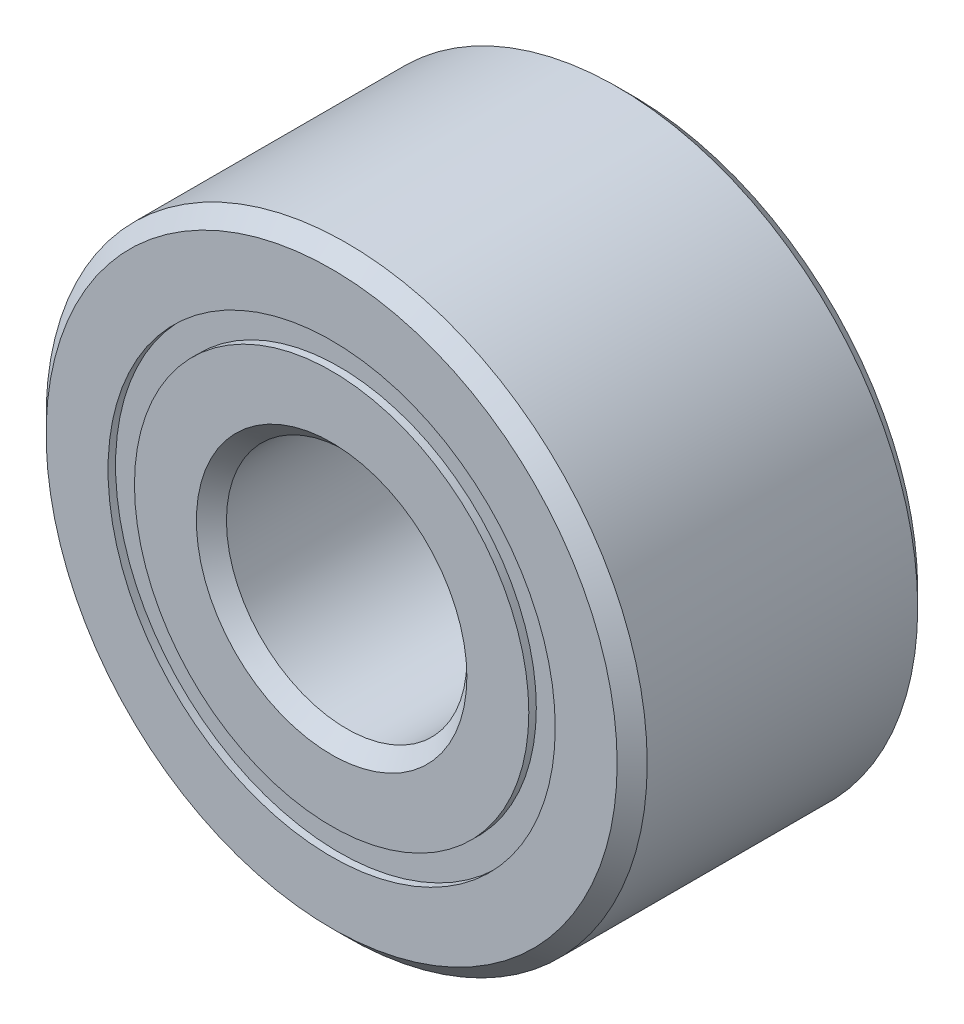
ISO-10303-21;
HEADER;
FILE_DESCRIPTION(('STEP AP214'),'2;1');
FILE_NAME('part.step','',(''),(''),'','','');
FILE_SCHEMA(('AUTOMOTIVE_DESIGN { 1 0 10303 214 1 1 1 1 }'));
ENDSEC;
DATA;
#1=APPLICATION_CONTEXT('core data for automotive mechanical design processes');
#2=APPLICATION_PROTOCOL_DEFINITION('international standard','automotive_design',2000,#1);
#3=PRODUCT_CONTEXT('',#1,'mechanical');
#4=PRODUCT('Part','Part','',(#3));
#5=PRODUCT_RELATED_PRODUCT_CATEGORY('part','',(#4));
#6=PRODUCT_DEFINITION_FORMATION('','',#4);
#7=PRODUCT_DEFINITION_CONTEXT('part definition',#1,'design');
#8=PRODUCT_DEFINITION('design','',#6,#7);
#9=PRODUCT_DEFINITION_SHAPE('','',#8);
#10=(LENGTH_UNIT() NAMED_UNIT(*) SI_UNIT(.MILLI.,.METRE.));
#11=(NAMED_UNIT(*) PLANE_ANGLE_UNIT() SI_UNIT($,.RADIAN.));
#12=(NAMED_UNIT(*) SI_UNIT($,.STERADIAN.) SOLID_ANGLE_UNIT());
#13=UNCERTAINTY_MEASURE_WITH_UNIT(LENGTH_MEASURE(1.E-05),#10,'distance_accuracy_value','');
#14=(GEOMETRIC_REPRESENTATION_CONTEXT(3) GLOBAL_UNCERTAINTY_ASSIGNED_CONTEXT((#13)) GLOBAL_UNIT_ASSIGNED_CONTEXT((#10,
#11,#12)) REPRESENTATION_CONTEXT('',''));
#15=CARTESIAN_POINT('',(0.,0.,0.));
#16=DIRECTION('',(0.,0.,1.));
#17=DIRECTION('',(1.,0.,0.));
#18=AXIS2_PLACEMENT_3D('',#15,#16,#17);
#19=CARTESIAN_POINT('',(0.,1.85989010989011,-1.1875));
#20=DIRECTION('',(0.,0.,1.));
#21=DIRECTION('',(1.,0.,0.));
#22=AXIS2_PLACEMENT_3D('',#19,#20,#21);
#23=PLANE('',#22);
#24=CARTESIAN_POINT('',(0.,0.,-1.1875));
#25=DIRECTION('',(0.,0.,1.));
#26=DIRECTION('',(1.,0.,0.));
#27=AXIS2_PLACEMENT_3D('',#24,#25,#26);
#28=CIRCLE('',#27,1.85989010989011);
#29=CARTESIAN_POINT('',(1.85989010989011,0.,-1.1875));
#30=VERTEX_POINT('',#29);
#31=EDGE_CURVE('E55',#30,#30,#28,.T.);
#32=ORIENTED_EDGE('',*,*,#31,.F.);
#33=EDGE_LOOP('',(#32));
#34=FACE_BOUND('',#33,.T.);
#35=CARTESIAN_POINT('',(0.,0.,-1.1875));
#36=DIRECTION('',(0.,0.,1.));
#37=DIRECTION('',(1.,0.,0.));
#38=AXIS2_PLACEMENT_3D('',#35,#36,#37);
#39=CIRCLE('',#38,1.64010989010989);
#40=CARTESIAN_POINT('',(1.64010989010989,0.,-1.1875));
#41=VERTEX_POINT('',#40);
#42=EDGE_CURVE('E11',#41,#41,#39,.T.);
#43=ORIENTED_EDGE('',*,*,#42,.T.);
#44=EDGE_LOOP('',(#43));
#45=FACE_BOUND('',#44,.T.);
#46=ADVANCED_FACE('F41',(#34,#45),#23,.F.);
#47=CARTESIAN_POINT('',(0.,0.,1.25));
#48=DIRECTION('',(0.,0.,1.));
#49=DIRECTION('',(1.,0.,0.));
#50=AXIS2_PLACEMENT_3D('',#47,#48,#49);
#51=CYLINDRICAL_SURFACE('',#50,1.64010989010989);
#52=ORIENTED_EDGE('',*,*,#42,.F.);
#53=EDGE_LOOP('',(#52));
#54=FACE_BOUND('',#53,.T.);
#55=CARTESIAN_POINT('',(0.,0.,-0.566319531325119));
#56=DIRECTION('',(0.,0.,1.));
#57=DIRECTION('',(1.,0.,0.));
#58=AXIS2_PLACEMENT_3D('',#55,#56,#57);
#59=CIRCLE('',#58,1.64010989010989);
#60=CARTESIAN_POINT('',(1.64010989010989,0.,-0.566319531325119));
#61=VERTEX_POINT('',#60);
#62=EDGE_CURVE('E47',#61,#61,#59,.T.);
#63=ORIENTED_EDGE('',*,*,#62,.T.);
#64=EDGE_LOOP('',(#63));
#65=FACE_BOUND('',#64,.T.);
#66=ADVANCED_FACE('F64',(#54,#65),#51,.F.);
#67=CARTESIAN_POINT('',(0.,1.85989010989011,-0.566319531325119));
#68=DIRECTION('',(0.,0.,-1.));
#69=DIRECTION('',(-1.,0.,0.));
#70=AXIS2_PLACEMENT_3D('',#67,#68,#69);
#71=PLANE('',#70);
#72=ORIENTED_EDGE('',*,*,#62,.F.);
#73=EDGE_LOOP('',(#72));
#74=FACE_BOUND('',#73,.T.);
#75=CARTESIAN_POINT('',(0.,0.,-0.566319531325119));
#76=DIRECTION('',(0.,0.,1.));
#77=DIRECTION('',(1.,0.,0.));
#78=AXIS2_PLACEMENT_3D('',#75,#76,#77);
#79=CIRCLE('',#78,1.85989010989011);
#80=CARTESIAN_POINT('',(1.85989010989011,0.,-0.566319531325119));
#81=VERTEX_POINT('',#80);
#82=EDGE_CURVE('E51',#81,#81,#79,.T.);
#83=ORIENTED_EDGE('',*,*,#82,.T.);
#84=EDGE_LOOP('',(#83));
#85=FACE_BOUND('',#84,.T.);
#86=ADVANCED_FACE('F68',(#74,#85),#71,.F.);
#87=CARTESIAN_POINT('',(0.,0.,1.25));
#88=DIRECTION('',(0.,0.,1.));
#89=DIRECTION('',(1.,0.,0.));
#90=AXIS2_PLACEMENT_3D('',#87,#88,#89);
#91=CYLINDRICAL_SURFACE('',#90,1.85989010989011);
#92=ORIENTED_EDGE('',*,*,#82,.F.);
#93=EDGE_LOOP('',(#92));
#94=FACE_BOUND('',#93,.T.);
#95=ORIENTED_EDGE('',*,*,#31,.T.);
#96=EDGE_LOOP('',(#95));
#97=FACE_BOUND('',#96,.T.);
#98=ADVANCED_FACE('F61',(#94,#97),#91,.T.);
#99=CLOSED_SHELL('',(#46,#66,#86,#98));
#100=MANIFOLD_SOLID_BREP('B2',#99);
#101=CARTESIAN_POINT('',(0.,1.85989010989011,1.1875));
#102=DIRECTION('',(0.,0.,-1.));
#103=DIRECTION('',(-1.,0.,0.));
#104=AXIS2_PLACEMENT_3D('',#101,#102,#103);
#105=PLANE('',#104);
#106=CARTESIAN_POINT('',(0.,0.,1.1875));
#107=DIRECTION('',(0.,0.,1.));
#108=DIRECTION('',(1.,0.,0.));
#109=AXIS2_PLACEMENT_3D('',#106,#107,#108);
#110=CIRCLE('',#109,1.64010989010989);
#111=CARTESIAN_POINT('',(1.64010989010989,0.,1.1875));
#112=VERTEX_POINT('',#111);
#113=EDGE_CURVE('E40',#112,#112,#110,.T.);
#114=ORIENTED_EDGE('',*,*,#113,.F.);
#115=EDGE_LOOP('',(#114));
#116=FACE_BOUND('',#115,.T.);
#117=CARTESIAN_POINT('',(0.,0.,1.1875));
#118=DIRECTION('',(0.,0.,1.));
#119=DIRECTION('',(1.,0.,0.));
#120=AXIS2_PLACEMENT_3D('',#117,#118,#119);
#121=CIRCLE('',#120,1.85989010989011);
#122=CARTESIAN_POINT('',(1.85989010989011,0.,1.1875));
#123=VERTEX_POINT('',#122);
#124=EDGE_CURVE('E122',#123,#123,#121,.T.);
#125=ORIENTED_EDGE('',*,*,#124,.T.);
#126=EDGE_LOOP('',(#125));
#127=FACE_BOUND('',#126,.T.);
#128=ADVANCED_FACE('F108',(#116,#127),#105,.F.);
#129=CARTESIAN_POINT('',(0.,0.,1.25));
#130=DIRECTION('',(0.,0.,1.));
#131=DIRECTION('',(1.,0.,0.));
#132=AXIS2_PLACEMENT_3D('',#129,#130,#131);
#133=CYLINDRICAL_SURFACE('',#132,1.64010989010989);
#134=CARTESIAN_POINT('',(0.,0.,0.566319531325118));
#135=DIRECTION('',(0.,0.,1.));
#136=DIRECTION('',(1.,0.,0.));
#137=AXIS2_PLACEMENT_3D('',#134,#135,#136);
#138=CIRCLE('',#137,1.64010989010989);
#139=CARTESIAN_POINT('',(1.64010989010989,0.,0.566319531325118));
#140=VERTEX_POINT('',#139);
#141=EDGE_CURVE('E114',#140,#140,#138,.T.);
#142=ORIENTED_EDGE('',*,*,#141,.F.);
#143=EDGE_LOOP('',(#142));
#144=FACE_BOUND('',#143,.T.);
#145=ORIENTED_EDGE('',*,*,#113,.T.);
#146=EDGE_LOOP('',(#145));
#147=FACE_BOUND('',#146,.T.);
#148=ADVANCED_FACE('F137',(#144,#147),#133,.F.);
#149=CARTESIAN_POINT('',(0.,1.85989010989011,0.566319531325118));
#150=DIRECTION('',(0.,0.,1.));
#151=DIRECTION('',(1.,0.,0.));
#152=AXIS2_PLACEMENT_3D('',#149,#150,#151);
#153=PLANE('',#152);
#154=CARTESIAN_POINT('',(0.,0.,0.566319531325118));
#155=DIRECTION('',(0.,0.,1.));
#156=DIRECTION('',(1.,0.,0.));
#157=AXIS2_PLACEMENT_3D('',#154,#155,#156);
#158=CIRCLE('',#157,1.85989010989011);
#159=CARTESIAN_POINT('',(1.85989010989011,0.,0.566319531325118));
#160=VERTEX_POINT('',#159);
#161=EDGE_CURVE('E118',#160,#160,#158,.T.);
#162=ORIENTED_EDGE('',*,*,#161,.F.);
#163=EDGE_LOOP('',(#162));
#164=FACE_BOUND('',#163,.T.);
#165=ORIENTED_EDGE('',*,*,#141,.T.);
#166=EDGE_LOOP('',(#165));
#167=FACE_BOUND('',#166,.T.);
#168=ADVANCED_FACE('F132',(#164,#167),#153,.F.);
#169=CARTESIAN_POINT('',(0.,0.,1.25));
#170=DIRECTION('',(0.,0.,1.));
#171=DIRECTION('',(1.,0.,0.));
#172=AXIS2_PLACEMENT_3D('',#169,#170,#171);
#173=CYLINDRICAL_SURFACE('',#172,1.85989010989011);
#174=ORIENTED_EDGE('',*,*,#124,.F.);
#175=EDGE_LOOP('',(#174));
#176=FACE_BOUND('',#175,.T.);
#177=ORIENTED_EDGE('',*,*,#161,.T.);
#178=EDGE_LOOP('',(#177));
#179=FACE_BOUND('',#178,.T.);
#180=ADVANCED_FACE('F129',(#176,#179),#173,.T.);
#181=CLOSED_SHELL('',(#128,#148,#168,#180));
#182=MANIFOLD_SOLID_BREP('B6',#181);
#183=CARTESIAN_POINT('',(-1.23743686707644,1.23743686707647,0.));
#184=DIRECTION('',(0.,0.,1.));
#185=DIRECTION('',(-0.707106781186539,0.707106781186556,0.));
#186=AXIS2_PLACEMENT_3D('',#183,#184,#185);
#187=SPHERICAL_SURFACE('',#186,0.566319531325119);
#188=CARTESIAN_POINT('',(-1.23743686707644,1.23743686707647,0.566319531325118));
#189=VERTEX_POINT('',#188);
#190=VERTEX_LOOP('',#189);
#191=FACE_BOUND('',#190,.T.);
#192=ADVANCED_FACE('F175',(#191),#187,.T.);
#193=CLOSED_SHELL('',(#192));
#194=MANIFOLD_SOLID_BREP('B35',#193);
#195=CARTESIAN_POINT('',(-1.75,0.,0.));
#196=DIRECTION('',(0.,0.,1.));
#197=DIRECTION('',(-1.,0.,0.));
#198=AXIS2_PLACEMENT_3D('',#195,#196,#197);
#199=SPHERICAL_SURFACE('',#198,0.566319531325119);
#200=CARTESIAN_POINT('',(-1.75,0.,0.566319531325118));
#201=VERTEX_POINT('',#200);
#202=VERTEX_LOOP('',#201);
#203=FACE_BOUND('',#202,.T.);
#204=ADVANCED_FACE('F195',(#203),#199,.T.);
#205=CLOSED_SHELL('',(#204));
#206=MANIFOLD_SOLID_BREP('B104',#205);
#207=CARTESIAN_POINT('',(-1.23743686707647,-1.23743686707645,0.));
#208=DIRECTION('',(0.,0.,1.));
#209=DIRECTION('',(-0.707106781186554,-0.707106781186541,0.));
#210=AXIS2_PLACEMENT_3D('',#207,#208,#209);
#211=SPHERICAL_SURFACE('',#210,0.566319531325119);
#212=CARTESIAN_POINT('',(-1.23743686707647,-1.23743686707645,0.566319531325118));
#213=VERTEX_POINT('',#212);
#214=VERTEX_LOOP('',#213);
#215=FACE_BOUND('',#214,.T.);
#216=ADVANCED_FACE('F215',(#215),#211,.T.);
#217=CLOSED_SHELL('',(#216));
#218=MANIFOLD_SOLID_BREP('B171',#217);
#219=CARTESIAN_POINT('',(0.,-1.75,0.));
#220=DIRECTION('',(0.,0.,1.));
#221=DIRECTION('',(0.,-1.,0.));
#222=AXIS2_PLACEMENT_3D('',#219,#220,#221);
#223=SPHERICAL_SURFACE('',#222,0.566319531325119);
#224=CARTESIAN_POINT('',(0.,-1.75,0.566319531325118));
#225=VERTEX_POINT('',#224);
#226=VERTEX_LOOP('',#225);
#227=FACE_BOUND('',#226,.T.);
#228=ADVANCED_FACE('F235',(#227),#223,.T.);
#229=CLOSED_SHELL('',(#228));
#230=MANIFOLD_SOLID_BREP('B191',#229);
#231=CARTESIAN_POINT('',(1.23743686707645,-1.23743686707646,0.));
#232=DIRECTION('',(0.,0.,1.));
#233=DIRECTION('',(0.707106781186544,-0.707106781186551,0.));
#234=AXIS2_PLACEMENT_3D('',#231,#232,#233);
#235=SPHERICAL_SURFACE('',#234,0.566319531325119);
#236=CARTESIAN_POINT('',(1.23743686707645,-1.23743686707646,0.566319531325118));
#237=VERTEX_POINT('',#236);
#238=VERTEX_LOOP('',#237);
#239=FACE_BOUND('',#238,.T.);
#240=ADVANCED_FACE('F255',(#239),#235,.T.);
#241=CLOSED_SHELL('',(#240));
#242=MANIFOLD_SOLID_BREP('B211',#241);
#243=CARTESIAN_POINT('',(1.75,0.,0.));
#244=DIRECTION('',(0.,0.,1.));
#245=DIRECTION('',(1.,0.,0.));
#246=AXIS2_PLACEMENT_3D('',#243,#244,#245);
#247=SPHERICAL_SURFACE('',#246,0.566319531325119);
#248=CARTESIAN_POINT('',(1.75,0.,0.566319531325118));
#249=VERTEX_POINT('',#248);
#250=VERTEX_LOOP('',#249);
#251=FACE_BOUND('',#250,.T.);
#252=ADVANCED_FACE('F275',(#251),#247,.T.);
#253=CLOSED_SHELL('',(#252));
#254=MANIFOLD_SOLID_BREP('B231',#253);
#255=CARTESIAN_POINT('',(1.23743686707646,1.23743686707646,0.));
#256=DIRECTION('',(0.,0.,1.));
#257=DIRECTION('',(0.707106781186549,0.707106781186546,0.));
#258=AXIS2_PLACEMENT_3D('',#255,#256,#257);
#259=SPHERICAL_SURFACE('',#258,0.566319531325119);
#260=CARTESIAN_POINT('',(1.23743686707646,1.23743686707646,0.566319531325118));
#261=VERTEX_POINT('',#260);
#262=VERTEX_LOOP('',#261);
#263=FACE_BOUND('',#262,.T.);
#264=ADVANCED_FACE('F295',(#263),#259,.T.);
#265=CLOSED_SHELL('',(#264));
#266=MANIFOLD_SOLID_BREP('B251',#265);
#267=CARTESIAN_POINT('',(0.,1.75,0.));
#268=DIRECTION('',(0.,0.,1.));
#269=DIRECTION('',(0.,1.,0.));
#270=AXIS2_PLACEMENT_3D('',#267,#268,#269);
#271=SPHERICAL_SURFACE('',#270,0.566319531325119);
#272=CARTESIAN_POINT('',(0.,1.75,0.566319531325118));
#273=VERTEX_POINT('',#272);
#274=VERTEX_LOOP('',#273);
#275=FACE_BOUND('',#274,.T.);
#276=ADVANCED_FACE('F317',(#275),#271,.T.);
#277=CLOSED_SHELL('',(#276));
#278=MANIFOLD_SOLID_BREP('B271',#277);
#279=CARTESIAN_POINT('',(0.,1.64010989010989,1.25));
#280=DIRECTION('',(0.,0.,-1.));
#281=DIRECTION('',(-1.,0.,0.));
#282=AXIS2_PLACEMENT_3D('',#279,#280,#281);
#283=PLANE('',#282);
#284=CARTESIAN_POINT('',(0.,0.,1.25));
#285=DIRECTION('',(0.,0.,1.));
#286=DIRECTION('',(1.,0.,0.));
#287=AXIS2_PLACEMENT_3D('',#284,#285,#286);
#288=CIRCLE('',#287,1.125);
#289=CARTESIAN_POINT('',(1.125,0.,1.25));
#290=VERTEX_POINT('',#289);
#291=EDGE_CURVE('E364',#290,#290,#288,.T.);
#292=ORIENTED_EDGE('',*,*,#291,.F.);
#293=EDGE_LOOP('',(#292));
#294=FACE_BOUND('',#293,.T.);
#295=CARTESIAN_POINT('',(0.,0.,1.25));
#296=DIRECTION('',(0.,0.,1.));
#297=DIRECTION('',(1.,0.,0.));
#298=AXIS2_PLACEMENT_3D('',#295,#296,#297);
#299=CIRCLE('',#298,1.64010989010989);
#300=CARTESIAN_POINT('',(1.64010989010989,0.,1.25));
#301=VERTEX_POINT('',#300);
#302=EDGE_CURVE('E316',#301,#301,#299,.T.);
#303=ORIENTED_EDGE('',*,*,#302,.T.);
#304=EDGE_LOOP('',(#303));
#305=FACE_BOUND('',#304,.T.);
#306=ADVANCED_FACE('F336',(#294,#305),#283,.F.);
#307=CARTESIAN_POINT('',(0.,0.,1.25));
#308=DIRECTION('',(0.,0.,1.));
#309=DIRECTION('',(1.,0.,0.));
#310=AXIS2_PLACEMENT_3D('',#307,#308,#309);
#311=CYLINDRICAL_SURFACE('',#310,1.64010989010989);
#312=ORIENTED_EDGE('',*,*,#302,.F.);
#313=EDGE_LOOP('',(#312));
#314=FACE_BOUND('',#313,.T.);
#315=CARTESIAN_POINT('',(0.,0.,0.555555555555555));
#316=DIRECTION('',(0.,0.,1.));
#317=DIRECTION('',(1.,0.,0.));
#318=AXIS2_PLACEMENT_3D('',#315,#316,#317);
#319=CIRCLE('',#318,1.64010989010989);
#320=CARTESIAN_POINT('',(1.64010989010989,0.,0.555555555555555));
#321=VERTEX_POINT('',#320);
#322=EDGE_CURVE('E342',#321,#321,#319,.T.);
#323=ORIENTED_EDGE('',*,*,#322,.T.);
#324=EDGE_LOOP('',(#323));
#325=FACE_BOUND('',#324,.T.);
#326=ADVANCED_FACE('F371',(#314,#325),#311,.T.);
#327=CARTESIAN_POINT('',(0.,0.,0.));
#328=DIRECTION('',(0.,0.,1.));
#329=DIRECTION('',(1.,0.,0.));
#330=AXIS2_PLACEMENT_3D('',#327,#328,#329);
#331=TOROIDAL_SURFACE('',#330,1.75,0.566319531325118);
#332=ORIENTED_EDGE('',*,*,#322,.F.);
#333=EDGE_LOOP('',(#332));
#334=FACE_BOUND('',#333,.T.);
#335=CARTESIAN_POINT('',(0.,0.,-0.555555555555556));
#336=DIRECTION('',(0.,0.,1.));
#337=DIRECTION('',(1.,0.,0.));
#338=AXIS2_PLACEMENT_3D('',#335,#336,#337);
#339=CIRCLE('',#338,1.64010989010989);
#340=CARTESIAN_POINT('',(1.64010989010989,0.,-0.555555555555556));
#341=VERTEX_POINT('',#340);
#342=EDGE_CURVE('E346',#341,#341,#339,.T.);
#343=ORIENTED_EDGE('',*,*,#342,.T.);
#344=EDGE_LOOP('',(#343));
#345=FACE_BOUND('',#344,.T.);
#346=ADVANCED_FACE('F375',(#334,#345),#331,.F.);
#347=CARTESIAN_POINT('',(0.,0.,1.25));
#348=DIRECTION('',(0.,0.,1.));
#349=DIRECTION('',(1.,0.,0.));
#350=AXIS2_PLACEMENT_3D('',#347,#348,#349);
#351=CYLINDRICAL_SURFACE('',#350,1.64010989010989);
#352=ORIENTED_EDGE('',*,*,#342,.F.);
#353=EDGE_LOOP('',(#352));
#354=FACE_BOUND('',#353,.T.);
#355=CARTESIAN_POINT('',(0.,0.,-1.25));
#356=DIRECTION('',(0.,0.,1.));
#357=DIRECTION('',(1.,0.,0.));
#358=AXIS2_PLACEMENT_3D('',#355,#356,#357);
#359=CIRCLE('',#358,1.64010989010989);
#360=CARTESIAN_POINT('',(1.64010989010989,0.,-1.25));
#361=VERTEX_POINT('',#360);
#362=EDGE_CURVE('E350',#361,#361,#359,.T.);
#363=ORIENTED_EDGE('',*,*,#362,.T.);
#364=EDGE_LOOP('',(#363));
#365=FACE_BOUND('',#364,.T.);
#366=ADVANCED_FACE('F380',(#354,#365),#351,.T.);
#367=CARTESIAN_POINT('',(0.,1.125,-1.25));
#368=DIRECTION('',(0.,0.,1.));
#369=DIRECTION('',(1.,0.,0.));
#370=AXIS2_PLACEMENT_3D('',#367,#368,#369);
#371=PLANE('',#370);
#372=ORIENTED_EDGE('',*,*,#362,.F.);
#373=EDGE_LOOP('',(#372));
#374=FACE_BOUND('',#373,.T.);
#375=CARTESIAN_POINT('',(0.,0.,-1.25));
#376=DIRECTION('',(0.,0.,1.));
#377=DIRECTION('',(1.,0.,0.));
#378=AXIS2_PLACEMENT_3D('',#375,#376,#377);
#379=CIRCLE('',#378,1.125);
#380=CARTESIAN_POINT('',(1.125,0.,-1.25));
#381=VERTEX_POINT('',#380);
#382=EDGE_CURVE('E355',#381,#381,#379,.T.);
#383=ORIENTED_EDGE('',*,*,#382,.T.);
#384=EDGE_LOOP('',(#383));
#385=FACE_BOUND('',#384,.T.);
#386=ADVANCED_FACE('F386',(#374,#385),#371,.F.);
#387=CARTESIAN_POINT('',(0.,0.,-1.125));
#388=DIRECTION('',(0.,0.,-1.));
#389=DIRECTION('',(-1.,0.,0.));
#390=AXIS2_PLACEMENT_3D('',#387,#388,#389);
#391=CONICAL_SURFACE('',#390,1.,0.785398163397448);
#392=ORIENTED_EDGE('',*,*,#382,.F.);
#393=EDGE_LOOP('',(#392));
#394=FACE_BOUND('',#393,.T.);
#395=CARTESIAN_POINT('',(0.,0.,-1.125));
#396=DIRECTION('',(0.,0.,1.));
#397=DIRECTION('',(1.,0.,0.));
#398=AXIS2_PLACEMENT_3D('',#395,#396,#397);
#399=CIRCLE('',#398,1.);
#400=CARTESIAN_POINT('',(1.,0.,-1.125));
#401=VERTEX_POINT('',#400);
#402=EDGE_CURVE('E358',#401,#401,#399,.T.);
#403=ORIENTED_EDGE('',*,*,#402,.T.);
#404=EDGE_LOOP('',(#403));
#405=FACE_BOUND('',#404,.T.);
#406=ADVANCED_FACE('F390',(#394,#405),#391,.F.);
#407=CARTESIAN_POINT('',(0.,0.,1.25));
#408=DIRECTION('',(0.,0.,1.));
#409=DIRECTION('',(1.,0.,0.));
#410=AXIS2_PLACEMENT_3D('',#407,#408,#409);
#411=CYLINDRICAL_SURFACE('',#410,1.);
#412=ORIENTED_EDGE('',*,*,#402,.F.);
#413=EDGE_LOOP('',(#412));
#414=FACE_BOUND('',#413,.T.);
#415=CARTESIAN_POINT('',(0.,0.,1.125));
#416=DIRECTION('',(0.,0.,1.));
#417=DIRECTION('',(1.,0.,0.));
#418=AXIS2_PLACEMENT_3D('',#415,#416,#417);
#419=CIRCLE('',#418,1.);
#420=CARTESIAN_POINT('',(1.,0.,1.125));
#421=VERTEX_POINT('',#420);
#422=EDGE_CURVE('E361',#421,#421,#419,.T.);
#423=ORIENTED_EDGE('',*,*,#422,.T.);
#424=EDGE_LOOP('',(#423));
#425=FACE_BOUND('',#424,.T.);
#426=ADVANCED_FACE('F394',(#414,#425),#411,.F.);
#427=CARTESIAN_POINT('',(0.,0.,1.25));
#428=DIRECTION('',(0.,0.,1.));
#429=DIRECTION('',(1.,0.,0.));
#430=AXIS2_PLACEMENT_3D('',#427,#428,#429);
#431=CONICAL_SURFACE('',#430,1.125,0.785398163397447);
#432=ORIENTED_EDGE('',*,*,#422,.F.);
#433=EDGE_LOOP('',(#432));
#434=FACE_BOUND('',#433,.T.);
#435=ORIENTED_EDGE('',*,*,#291,.T.);
#436=EDGE_LOOP('',(#435));
#437=FACE_BOUND('',#436,.T.);
#438=ADVANCED_FACE('F368',(#434,#437),#431,.F.);
#439=CLOSED_SHELL('',(#306,#326,#346,#366,#386,#406,#426,#438));
#440=MANIFOLD_SOLID_BREP('B291',#439);
#441=CARTESIAN_POINT('',(0.,0.,1.125));
#442=DIRECTION('',(0.,0.,-1.));
#443=DIRECTION('',(-1.,0.,0.));
#444=AXIS2_PLACEMENT_3D('',#441,#442,#443);
#445=CONICAL_SURFACE('',#444,2.5,0.785398163397449);
#446=CARTESIAN_POINT('',(0.,0.,1.25));
#447=DIRECTION('',(0.,0.,1.));
#448=DIRECTION('',(1.,0.,0.));
#449=AXIS2_PLACEMENT_3D('',#446,#447,#448);
#450=CIRCLE('',#449,2.375);
#451=CARTESIAN_POINT('',(2.375,0.,1.25));
#452=VERTEX_POINT('',#451);
#453=EDGE_CURVE('E485',#452,#452,#450,.T.);
#454=ORIENTED_EDGE('',*,*,#453,.F.);
#455=EDGE_LOOP('',(#454));
#456=FACE_BOUND('',#455,.T.);
#457=CARTESIAN_POINT('',(0.,0.,1.125));
#458=DIRECTION('',(0.,0.,1.));
#459=DIRECTION('',(1.,0.,0.));
#460=AXIS2_PLACEMENT_3D('',#457,#458,#459);
#461=CIRCLE('',#460,2.5);
#462=CARTESIAN_POINT('',(2.5,0.,1.125));
#463=VERTEX_POINT('',#462);
#464=EDGE_CURVE('E335',#463,#463,#461,.T.);
#465=ORIENTED_EDGE('',*,*,#464,.T.);
#466=EDGE_LOOP('',(#465));
#467=FACE_BOUND('',#466,.T.);
#468=ADVANCED_FACE('F457',(#456,#467),#445,.T.);
#469=CARTESIAN_POINT('',(0.,0.,1.25));
#470=DIRECTION('',(0.,0.,1.));
#471=DIRECTION('',(1.,0.,0.));
#472=AXIS2_PLACEMENT_3D('',#469,#470,#471);
#473=CYLINDRICAL_SURFACE('',#472,2.5);
#474=ORIENTED_EDGE('',*,*,#464,.F.);
#475=EDGE_LOOP('',(#474));
#476=FACE_BOUND('',#475,.T.);
#477=CARTESIAN_POINT('',(0.,0.,-1.125));
#478=DIRECTION('',(0.,0.,1.));
#479=DIRECTION('',(1.,0.,0.));
#480=AXIS2_PLACEMENT_3D('',#477,#478,#479);
#481=CIRCLE('',#480,2.5);
#482=CARTESIAN_POINT('',(2.5,0.,-1.125));
#483=VERTEX_POINT('',#482);
#484=EDGE_CURVE('E463',#483,#483,#481,.T.);
#485=ORIENTED_EDGE('',*,*,#484,.T.);
#486=EDGE_LOOP('',(#485));
#487=FACE_BOUND('',#486,.T.);
#488=ADVANCED_FACE('F492',(#476,#487),#473,.T.);
#489=CARTESIAN_POINT('',(0.,0.,-1.25));
#490=DIRECTION('',(0.,0.,1.));
#491=DIRECTION('',(1.,0.,0.));
#492=AXIS2_PLACEMENT_3D('',#489,#490,#491);
#493=CONICAL_SURFACE('',#492,2.375,0.78539816339745);
#494=ORIENTED_EDGE('',*,*,#484,.F.);
#495=EDGE_LOOP('',(#494));
#496=FACE_BOUND('',#495,.T.);
#497=CARTESIAN_POINT('',(0.,0.,-1.25));
#498=DIRECTION('',(0.,0.,1.));
#499=DIRECTION('',(1.,0.,0.));
#500=AXIS2_PLACEMENT_3D('',#497,#498,#499);
#501=CIRCLE('',#500,2.375);
#502=CARTESIAN_POINT('',(2.375,0.,-1.25));
#503=VERTEX_POINT('',#502);
#504=EDGE_CURVE('E467',#503,#503,#501,.T.);
#505=ORIENTED_EDGE('',*,*,#504,.T.);
#506=EDGE_LOOP('',(#505));
#507=FACE_BOUND('',#506,.T.);
#508=ADVANCED_FACE('F496',(#496,#507),#493,.T.);
#509=CARTESIAN_POINT('',(0.,2.375,-1.25));
#510=DIRECTION('',(0.,0.,1.));
#511=DIRECTION('',(1.,0.,0.));
#512=AXIS2_PLACEMENT_3D('',#509,#510,#511);
#513=PLANE('',#512);
#514=ORIENTED_EDGE('',*,*,#504,.F.);
#515=EDGE_LOOP('',(#514));
#516=FACE_BOUND('',#515,.T.);
#517=CARTESIAN_POINT('',(0.,0.,-1.25));
#518=DIRECTION('',(0.,0.,1.));
#519=DIRECTION('',(1.,0.,0.));
#520=AXIS2_PLACEMENT_3D('',#517,#518,#519);
#521=CIRCLE('',#520,1.85989010989011);
#522=CARTESIAN_POINT('',(1.85989010989011,0.,-1.25));
#523=VERTEX_POINT('',#522);
#524=EDGE_CURVE('E471',#523,#523,#521,.T.);
#525=ORIENTED_EDGE('',*,*,#524,.T.);
#526=EDGE_LOOP('',(#525));
#527=FACE_BOUND('',#526,.T.);
#528=ADVANCED_FACE('F501',(#516,#527),#513,.F.);
#529=CARTESIAN_POINT('',(0.,0.,1.25));
#530=DIRECTION('',(0.,0.,1.));
#531=DIRECTION('',(1.,0.,0.));
#532=AXIS2_PLACEMENT_3D('',#529,#530,#531);
#533=CYLINDRICAL_SURFACE('',#532,1.85989010989011);
#534=ORIENTED_EDGE('',*,*,#524,.F.);
#535=EDGE_LOOP('',(#534));
#536=FACE_BOUND('',#535,.T.);
#537=CARTESIAN_POINT('',(0.,0.,-0.555555555555556));
#538=DIRECTION('',(0.,0.,1.));
#539=DIRECTION('',(1.,0.,0.));
#540=AXIS2_PLACEMENT_3D('',#537,#538,#539);
#541=CIRCLE('',#540,1.85989010989011);
#542=CARTESIAN_POINT('',(1.85989010989011,0.,-0.555555555555556));
#543=VERTEX_POINT('',#542);
#544=EDGE_CURVE('E476',#543,#543,#541,.T.);
#545=ORIENTED_EDGE('',*,*,#544,.T.);
#546=EDGE_LOOP('',(#545));
#547=FACE_BOUND('',#546,.T.);
#548=ADVANCED_FACE('F507',(#536,#547),#533,.F.);
#549=CARTESIAN_POINT('',(0.,0.,0.));
#550=DIRECTION('',(0.,0.,1.));
#551=DIRECTION('',(1.,0.,0.));
#552=AXIS2_PLACEMENT_3D('',#549,#550,#551);
#553=TOROIDAL_SURFACE('',#552,1.75,0.566319531325119);
#554=ORIENTED_EDGE('',*,*,#544,.F.);
#555=EDGE_LOOP('',(#554));
#556=FACE_BOUND('',#555,.T.);
#557=CARTESIAN_POINT('',(0.,0.,0.555555555555555));
#558=DIRECTION('',(0.,0.,1.));
#559=DIRECTION('',(1.,0.,0.));
#560=AXIS2_PLACEMENT_3D('',#557,#558,#559);
#561=CIRCLE('',#560,1.85989010989011);
#562=CARTESIAN_POINT('',(1.85989010989011,0.,0.555555555555555));
#563=VERTEX_POINT('',#562);
#564=EDGE_CURVE('E479',#563,#563,#561,.T.);
#565=ORIENTED_EDGE('',*,*,#564,.T.);
#566=EDGE_LOOP('',(#565));
#567=FACE_BOUND('',#566,.T.);
#568=ADVANCED_FACE('F511',(#556,#567),#553,.F.);
#569=CARTESIAN_POINT('',(0.,0.,1.25));
#570=DIRECTION('',(0.,0.,1.));
#571=DIRECTION('',(1.,0.,0.));
#572=AXIS2_PLACEMENT_3D('',#569,#570,#571);
#573=CYLINDRICAL_SURFACE('',#572,1.85989010989011);
#574=ORIENTED_EDGE('',*,*,#564,.F.);
#575=EDGE_LOOP('',(#574));
#576=FACE_BOUND('',#575,.T.);
#577=CARTESIAN_POINT('',(0.,0.,1.25));
#578=DIRECTION('',(0.,0.,1.));
#579=DIRECTION('',(1.,0.,0.));
#580=AXIS2_PLACEMENT_3D('',#577,#578,#579);
#581=CIRCLE('',#580,1.85989010989011);
#582=CARTESIAN_POINT('',(1.85989010989011,0.,1.25));
#583=VERTEX_POINT('',#582);
#584=EDGE_CURVE('E482',#583,#583,#581,.T.);
#585=ORIENTED_EDGE('',*,*,#584,.T.);
#586=EDGE_LOOP('',(#585));
#587=FACE_BOUND('',#586,.T.);
#588=ADVANCED_FACE('F515',(#576,#587),#573,.F.);
#589=CARTESIAN_POINT('',(0.,2.375,1.25));
#590=DIRECTION('',(0.,0.,-1.));
#591=DIRECTION('',(-1.,0.,0.));
#592=AXIS2_PLACEMENT_3D('',#589,#590,#591);
#593=PLANE('',#592);
#594=ORIENTED_EDGE('',*,*,#584,.F.);
#595=EDGE_LOOP('',(#594));
#596=FACE_BOUND('',#595,.T.);
#597=ORIENTED_EDGE('',*,*,#453,.T.);
#598=EDGE_LOOP('',(#597));
#599=FACE_BOUND('',#598,.T.);
#600=ADVANCED_FACE('F489',(#596,#599),#593,.F.);
#601=CLOSED_SHELL('',(#468,#488,#508,#528,#548,#568,#588,#600));
#602=MANIFOLD_SOLID_BREP('B311',#601);
#603=ADVANCED_BREP_SHAPE_REPRESENTATION('',(#18,#100,#182,#194,#206,#218,#230,#242,#254,#266,
#278,#440,#602),#14);
#604=SHAPE_DEFINITION_REPRESENTATION(#9,#603);
ENDSEC;
END-ISO-10303-21;
